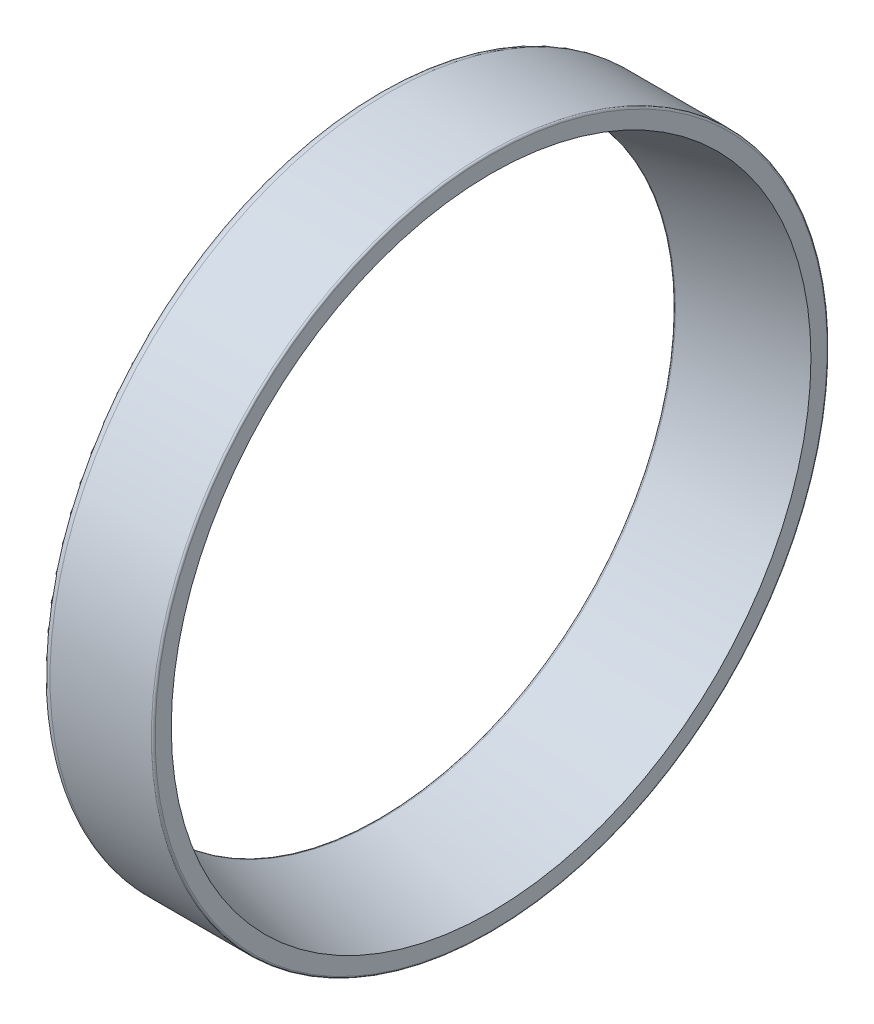
ISO-10303-21;
HEADER;
FILE_DESCRIPTION(('STEP AP214'),'2;1');
FILE_NAME('part.step','',(''),(''),'','','');
FILE_SCHEMA(('AUTOMOTIVE_DESIGN { 1 0 10303 214 1 1 1 1 }'));
ENDSEC;
DATA;
#1=APPLICATION_CONTEXT('core data for automotive mechanical design processes');
#2=APPLICATION_PROTOCOL_DEFINITION('international standard','automotive_design',2000,#1);
#3=PRODUCT_CONTEXT('',#1,'mechanical');
#4=PRODUCT('Part','Part','',(#3));
#5=PRODUCT_RELATED_PRODUCT_CATEGORY('part','',(#4));
#6=PRODUCT_DEFINITION_FORMATION('','',#4);
#7=PRODUCT_DEFINITION_CONTEXT('part definition',#1,'design');
#8=PRODUCT_DEFINITION('design','',#6,#7);
#9=PRODUCT_DEFINITION_SHAPE('','',#8);
#10=(LENGTH_UNIT() NAMED_UNIT(*) SI_UNIT(.MILLI.,.METRE.));
#11=(NAMED_UNIT(*) PLANE_ANGLE_UNIT() SI_UNIT($,.RADIAN.));
#12=(NAMED_UNIT(*) SI_UNIT($,.STERADIAN.) SOLID_ANGLE_UNIT());
#13=UNCERTAINTY_MEASURE_WITH_UNIT(LENGTH_MEASURE(1.E-05),#10,'distance_accuracy_value','');
#14=(GEOMETRIC_REPRESENTATION_CONTEXT(3) GLOBAL_UNCERTAINTY_ASSIGNED_CONTEXT((#13)) GLOBAL_UNIT_ASSIGNED_CONTEXT((#10,
#11,#12)) REPRESENTATION_CONTEXT('',''));
#15=CARTESIAN_POINT('',(0.,0.,0.));
#16=DIRECTION('',(0.,0.,1.));
#17=DIRECTION('',(1.,0.,0.));
#18=AXIS2_PLACEMENT_3D('',#15,#16,#17);
#19=CARTESIAN_POINT('',(0.2,0.,0.));
#20=DIRECTION('',(1.,0.,0.));
#21=DIRECTION('',(0.,0.,-1.));
#22=AXIS2_PLACEMENT_3D('',#19,#20,#21);
#23=TOROIDAL_SURFACE('',#22,31.5925084378141,0.2);
#24=CARTESIAN_POINT('',(0.244422021310038,0.,0.));
#25=DIRECTION('',(1.,0.,0.));
#26=DIRECTION('',(0.,1.,0.));
#27=AXIS2_PLACEMENT_3D('',#24,#25,#26);
#28=CIRCLE('',#27,31.397504119855);
#29=CARTESIAN_POINT('',(0.244422021310038,31.397504119855,0.));
#30=VERTEX_POINT('',#29);
#31=EDGE_CURVE('E11',#30,#30,#28,.T.);
#32=ORIENTED_EDGE('',*,*,#31,.T.);
#33=EDGE_LOOP('',(#32));
#34=FACE_BOUND('',#33,.T.);
#35=CARTESIAN_POINT('',(0.,0.,0.));
#36=DIRECTION('',(1.,0.,0.));
#37=DIRECTION('',(0.,1.,0.));
#38=AXIS2_PLACEMENT_3D('',#35,#36,#37);
#39=CIRCLE('',#38,31.5925084378141);
#40=CARTESIAN_POINT('',(0.,31.5925084378141,0.));
#41=VERTEX_POINT('',#40);
#42=EDGE_CURVE('E55',#41,#41,#39,.T.);
#43=ORIENTED_EDGE('',*,*,#42,.F.);
#44=EDGE_LOOP('',(#43));
#45=FACE_BOUND('',#44,.T.);
#46=ADVANCED_FACE('F17',(#34,#45),#23,.T.);
#47=CARTESIAN_POINT('',(6.12221101065502,0.,0.));
#48=DIRECTION('',(1.,0.,0.));
#49=DIRECTION('',(0.,1.,0.));
#50=AXIS2_PLACEMENT_3D('',#47,#48,#49);
#51=CONICAL_SURFACE('',#50,32.7364655873401,0.223978102908433);
#52=CARTESIAN_POINT('',(12.,0.,0.));
#53=DIRECTION('',(1.,0.,0.));
#54=DIRECTION('',(0.,1.,0.));
#55=AXIS2_PLACEMENT_3D('',#52,#53,#54);
#56=CIRCLE('',#55,34.0754270548253);
#57=CARTESIAN_POINT('',(12.,34.0754270548253,0.));
#58=VERTEX_POINT('',#57);
#59=EDGE_CURVE('E28',#58,#58,#56,.T.);
#60=ORIENTED_EDGE('',*,*,#59,.T.);
#61=EDGE_LOOP('',(#60));
#62=FACE_BOUND('',#61,.T.);
#63=ORIENTED_EDGE('',*,*,#31,.F.);
#64=EDGE_LOOP('',(#63));
#65=FACE_BOUND('',#64,.T.);
#66=ADVANCED_FACE('F74',(#62,#65),#51,.F.);
#67=CARTESIAN_POINT('',(12.,34.9377135274126,0.));
#68=DIRECTION('',(1.,0.,0.));
#69=DIRECTION('',(0.,1.,0.));
#70=AXIS2_PLACEMENT_3D('',#67,#68,#69);
#71=PLANE('',#70);
#72=CARTESIAN_POINT('',(12.,0.,0.));
#73=DIRECTION('',(1.,0.,0.));
#74=DIRECTION('',(0.,1.,0.));
#75=AXIS2_PLACEMENT_3D('',#72,#73,#74);
#76=CIRCLE('',#75,35.8);
#77=CARTESIAN_POINT('',(12.,35.8,0.));
#78=VERTEX_POINT('',#77);
#79=EDGE_CURVE('E69',#78,#78,#76,.T.);
#80=ORIENTED_EDGE('',*,*,#79,.T.);
#81=EDGE_LOOP('',(#80));
#82=FACE_BOUND('',#81,.T.);
#83=ORIENTED_EDGE('',*,*,#59,.F.);
#84=EDGE_LOOP('',(#83));
#85=FACE_BOUND('',#84,.T.);
#86=ADVANCED_FACE('F77',(#82,#85),#71,.T.);
#87=CARTESIAN_POINT('',(11.8,0.,0.));
#88=DIRECTION('',(1.,0.,0.));
#89=DIRECTION('',(0.,0.,-1.));
#90=AXIS2_PLACEMENT_3D('',#87,#88,#89);
#91=TOROIDAL_SURFACE('',#90,35.8,0.2);
#92=CARTESIAN_POINT('',(11.8,0.,0.));
#93=DIRECTION('',(1.,0.,0.));
#94=DIRECTION('',(0.,1.,0.));
#95=AXIS2_PLACEMENT_3D('',#92,#93,#94);
#96=CIRCLE('',#95,36.);
#97=CARTESIAN_POINT('',(11.8,36.,0.));
#98=VERTEX_POINT('',#97);
#99=EDGE_CURVE('E48',#98,#98,#96,.T.);
#100=ORIENTED_EDGE('',*,*,#99,.T.);
#101=EDGE_LOOP('',(#100));
#102=FACE_BOUND('',#101,.T.);
#103=ORIENTED_EDGE('',*,*,#79,.F.);
#104=EDGE_LOOP('',(#103));
#105=FACE_BOUND('',#104,.T.);
#106=ADVANCED_FACE('F19',(#102,#105),#91,.T.);
#107=CARTESIAN_POINT('',(6.4,0.,0.));
#108=DIRECTION('',(-1.,0.,0.));
#109=DIRECTION('',(0.,1.,0.));
#110=AXIS2_PLACEMENT_3D('',#107,#108,#109);
#111=CYLINDRICAL_SURFACE('',#110,36.);
#112=CARTESIAN_POINT('',(1.,0.,0.));
#113=DIRECTION('',(1.,0.,0.));
#114=DIRECTION('',(0.,1.,0.));
#115=AXIS2_PLACEMENT_3D('',#112,#113,#114);
#116=CIRCLE('',#115,36.);
#117=CARTESIAN_POINT('',(1.,36.,0.));
#118=VERTEX_POINT('',#117);
#119=EDGE_CURVE('E21',#118,#118,#116,.T.);
#120=ORIENTED_EDGE('',*,*,#119,.T.);
#121=EDGE_LOOP('',(#120));
#122=FACE_BOUND('',#121,.T.);
#123=ORIENTED_EDGE('',*,*,#99,.F.);
#124=EDGE_LOOP('',(#123));
#125=FACE_BOUND('',#124,.T.);
#126=ADVANCED_FACE('F86',(#122,#125),#111,.T.);
#127=CARTESIAN_POINT('',(1.,0.,0.));
#128=DIRECTION('',(1.,0.,0.));
#129=DIRECTION('',(0.,0.,-1.));
#130=AXIS2_PLACEMENT_3D('',#127,#128,#129);
#131=TOROIDAL_SURFACE('',#130,35.,1.);
#132=CARTESIAN_POINT('',(0.,0.,0.));
#133=DIRECTION('',(1.,0.,0.));
#134=DIRECTION('',(0.,1.,0.));
#135=AXIS2_PLACEMENT_3D('',#132,#133,#134);
#136=CIRCLE('',#135,35.);
#137=CARTESIAN_POINT('',(0.,35.,0.));
#138=VERTEX_POINT('',#137);
#139=EDGE_CURVE('E60',#138,#138,#136,.T.);
#140=ORIENTED_EDGE('',*,*,#139,.T.);
#141=EDGE_LOOP('',(#140));
#142=FACE_BOUND('',#141,.T.);
#143=ORIENTED_EDGE('',*,*,#119,.F.);
#144=EDGE_LOOP('',(#143));
#145=FACE_BOUND('',#144,.T.);
#146=ADVANCED_FACE('F94',(#142,#145),#131,.T.);
#147=CARTESIAN_POINT('',(0.,33.2962542189071,0.));
#148=DIRECTION('',(-1.,0.,0.));
#149=DIRECTION('',(0.,-1.,0.));
#150=AXIS2_PLACEMENT_3D('',#147,#148,#149);
#151=PLANE('',#150);
#152=ORIENTED_EDGE('',*,*,#42,.T.);
#153=EDGE_LOOP('',(#152));
#154=FACE_BOUND('',#153,.T.);
#155=ORIENTED_EDGE('',*,*,#139,.F.);
#156=EDGE_LOOP('',(#155));
#157=FACE_BOUND('',#156,.T.);
#158=ADVANCED_FACE('F56',(#154,#157),#151,.T.);
#159=CLOSED_SHELL('',(#46,#66,#86,#106,#126,#146,#158));
#160=MANIFOLD_SOLID_BREP('B1',#159);
#161=ADVANCED_BREP_SHAPE_REPRESENTATION('',(#18,#160),#14);
#162=SHAPE_DEFINITION_REPRESENTATION(#9,#161);
ENDSEC;
END-ISO-10303-21;
